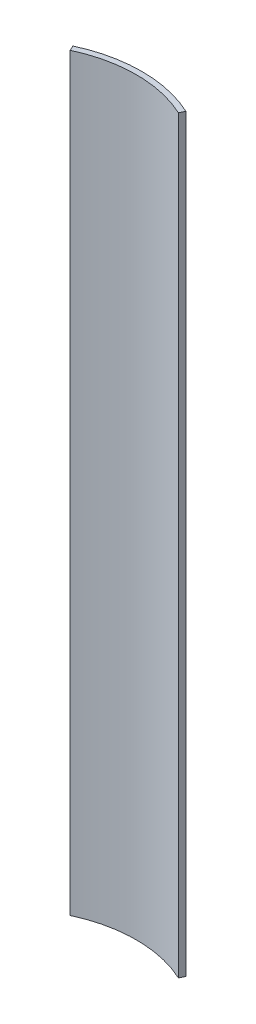
ISO-10303-21;
HEADER;
FILE_DESCRIPTION(('STEP AP214'),'2;1');
FILE_NAME('part.step','',(''),(''),'','','');
FILE_SCHEMA(('AUTOMOTIVE_DESIGN { 1 0 10303 214 1 1 1 1 }'));
ENDSEC;
DATA;
#1=APPLICATION_CONTEXT('core data for automotive mechanical design processes');
#2=APPLICATION_PROTOCOL_DEFINITION('international standard','automotive_design',2000,#1);
#3=PRODUCT_CONTEXT('',#1,'mechanical');
#4=PRODUCT('Part','Part','',(#3));
#5=PRODUCT_RELATED_PRODUCT_CATEGORY('part','',(#4));
#6=PRODUCT_DEFINITION_FORMATION('','',#4);
#7=PRODUCT_DEFINITION_CONTEXT('part definition',#1,'design');
#8=PRODUCT_DEFINITION('design','',#6,#7);
#9=PRODUCT_DEFINITION_SHAPE('','',#8);
#10=(LENGTH_UNIT() NAMED_UNIT(*) SI_UNIT(.MILLI.,.METRE.));
#11=(NAMED_UNIT(*) PLANE_ANGLE_UNIT() SI_UNIT($,.RADIAN.));
#12=(NAMED_UNIT(*) SI_UNIT($,.STERADIAN.) SOLID_ANGLE_UNIT());
#13=UNCERTAINTY_MEASURE_WITH_UNIT(LENGTH_MEASURE(1.E-05),#10,'distance_accuracy_value','');
#14=(GEOMETRIC_REPRESENTATION_CONTEXT(3) GLOBAL_UNCERTAINTY_ASSIGNED_CONTEXT((#13)) GLOBAL_UNIT_ASSIGNED_CONTEXT((#10,
#11,#12)) REPRESENTATION_CONTEXT('',''));
#15=CARTESIAN_POINT('',(0.,0.,0.));
#16=DIRECTION('',(0.,0.,1.));
#17=DIRECTION('',(1.,0.,0.));
#18=AXIS2_PLACEMENT_3D('',#15,#16,#17);
#19=CARTESIAN_POINT('',(0.,427.1518,0.));
#20=DIRECTION('',(0.,-1.,0.));
#21=DIRECTION('',(0.,0.,-1.));
#22=AXIS2_PLACEMENT_3D('',#19,#20,#21);
#23=CYLINDRICAL_SURFACE('',#22,76.2);
#24=CARTESIAN_POINT('',(0.,0.,0.));
#25=DIRECTION('',(0.,1.,0.));
#26=DIRECTION('',(0.,0.,1.));
#27=AXIS2_PLACEMENT_3D('',#24,#25,#26);
#28=CIRCLE('',#27,76.2);
#29=CARTESIAN_POINT('',(32.2035115446414,0.,-69.0606533721927));
#30=VERTEX_POINT('',#29);
#31=CARTESIAN_POINT('',(-32.2035115446414,0.,-69.0606533721927));
#32=VERTEX_POINT('',#31);
#33=EDGE_CURVE('E96',#30,#32,#28,.T.);
#34=ORIENTED_EDGE('',*,*,#33,.T.);
#35=DIRECTION('',(0.,-1.,0.));
#36=VECTOR('',#35,1.);
#37=CARTESIAN_POINT('',(-32.2035115446414,427.1518,-69.0606533721927));
#38=LINE('',#37,#36);
#39=CARTESIAN_POINT('',(-32.2035115446414,427.1518,-69.0606533721927));
#40=VERTEX_POINT('',#39);
#41=EDGE_CURVE('E11',#40,#32,#38,.T.);
#42=ORIENTED_EDGE('',*,*,#41,.F.);
#43=CARTESIAN_POINT('',(0.,427.1518,0.));
#44=DIRECTION('',(0.,1.,0.));
#45=DIRECTION('',(0.,0.,1.));
#46=AXIS2_PLACEMENT_3D('',#43,#44,#45);
#47=CIRCLE('',#46,76.2);
#48=CARTESIAN_POINT('',(32.2035115446414,427.1518,-69.0606533721927));
#49=VERTEX_POINT('',#48);
#50=EDGE_CURVE('E84',#49,#40,#47,.T.);
#51=ORIENTED_EDGE('',*,*,#50,.F.);
#52=DIRECTION('',(0.,-1.,0.));
#53=VECTOR('',#52,1.);
#54=CARTESIAN_POINT('',(32.2035115446414,427.1518,-69.0606533721927));
#55=LINE('',#54,#53);
#56=EDGE_CURVE('E92',#49,#30,#55,.T.);
#57=ORIENTED_EDGE('',*,*,#56,.T.);
#58=EDGE_LOOP('',(#34,#42,#51,#57));
#59=FACE_BOUND('',#58,.T.);
#60=ADVANCED_FACE('F33',(#59),#23,.T.);
#61=CARTESIAN_POINT('',(-30.8616985636147,427.1518,-66.1831261483513));
#62=DIRECTION('',(0.906307787036649,0.,-0.4226182617407));
#63=DIRECTION('',(-0.4226182617407,0.,-0.90630778703665));
#64=AXIS2_PLACEMENT_3D('',#61,#62,#63);
#65=PLANE('',#64);
#66=DIRECTION('',(0.4226182617407,0.,0.90630778703665));
#67=VECTOR('',#66,1.);
#68=CARTESIAN_POINT('',(-30.8616985636147,0.,-66.1831261483513));
#69=LINE('',#68,#67);
#70=CARTESIAN_POINT('',(-30.8616985636147,0.,-66.1831261483513));
#71=VERTEX_POINT('',#70);
#72=EDGE_CURVE('E88',#32,#71,#69,.T.);
#73=ORIENTED_EDGE('',*,*,#72,.T.);
#74=DIRECTION('',(0.,-1.,0.));
#75=VECTOR('',#74,1.);
#76=CARTESIAN_POINT('',(-30.8616985636147,427.1518,-66.1831261483513));
#77=LINE('',#76,#75);
#78=CARTESIAN_POINT('',(-30.8616985636147,427.1518,-66.1831261483513));
#79=VERTEX_POINT('',#78);
#80=EDGE_CURVE('E41',#79,#71,#77,.T.);
#81=ORIENTED_EDGE('',*,*,#80,.F.);
#82=DIRECTION('',(0.4226182617407,0.,0.90630778703665));
#83=VECTOR('',#82,1.);
#84=CARTESIAN_POINT('',(-30.8616985636147,427.1518,-66.1831261483513));
#85=LINE('',#84,#83);
#86=EDGE_CURVE('E79',#40,#79,#85,.T.);
#87=ORIENTED_EDGE('',*,*,#86,.F.);
#88=ORIENTED_EDGE('',*,*,#41,.T.);
#89=EDGE_LOOP('',(#73,#81,#87,#88));
#90=FACE_BOUND('',#89,.T.);
#91=ADVANCED_FACE('F87',(#90),#65,.F.);
#92=CARTESIAN_POINT('',(0.,427.1518,0.));
#93=DIRECTION('',(0.,-1.,0.));
#94=DIRECTION('',(0.,0.,-1.));
#95=AXIS2_PLACEMENT_3D('',#92,#93,#94);
#96=CYLINDRICAL_SURFACE('',#95,73.025);
#97=CARTESIAN_POINT('',(0.,0.,0.));
#98=DIRECTION('',(0.,-1.,0.));
#99=DIRECTION('',(0.,0.,1.));
#100=AXIS2_PLACEMENT_3D('',#97,#98,#99);
#101=CIRCLE('',#100,73.025);
#102=CARTESIAN_POINT('',(30.8616985636146,0.,-66.1831261483513));
#103=VERTEX_POINT('',#102);
#104=EDGE_CURVE('E66',#71,#103,#101,.T.);
#105=ORIENTED_EDGE('',*,*,#104,.T.);
#106=DIRECTION('',(0.,-1.,0.));
#107=VECTOR('',#106,1.);
#108=CARTESIAN_POINT('',(30.8616985636146,427.1518,-66.1831261483513));
#109=LINE('',#108,#107);
#110=CARTESIAN_POINT('',(30.8616985636146,427.1518,-66.1831261483513));
#111=VERTEX_POINT('',#110);
#112=EDGE_CURVE('E89',#111,#103,#109,.T.);
#113=ORIENTED_EDGE('',*,*,#112,.F.);
#114=CARTESIAN_POINT('',(0.,427.1518,0.));
#115=DIRECTION('',(0.,-1.,0.));
#116=DIRECTION('',(0.,0.,1.));
#117=AXIS2_PLACEMENT_3D('',#114,#115,#116);
#118=CIRCLE('',#117,73.025);
#119=EDGE_CURVE('E82',#79,#111,#118,.T.);
#120=ORIENTED_EDGE('',*,*,#119,.F.);
#121=ORIENTED_EDGE('',*,*,#80,.T.);
#122=EDGE_LOOP('',(#105,#113,#120,#121));
#123=FACE_BOUND('',#122,.T.);
#124=ADVANCED_FACE('F90',(#123),#96,.F.);
#125=CARTESIAN_POINT('',(30.8616985636146,427.1518,-66.1831261483513));
#126=DIRECTION('',(-0.90630778703665,0.,-0.4226182617407));
#127=DIRECTION('',(-0.4226182617407,0.,0.90630778703665));
#128=AXIS2_PLACEMENT_3D('',#125,#126,#127);
#129=PLANE('',#128);
#130=DIRECTION('',(0.4226182617407,0.,-0.90630778703665));
#131=VECTOR('',#130,1.);
#132=CARTESIAN_POINT('',(30.8616985636146,0.,-66.1831261483513));
#133=LINE('',#132,#131);
#134=EDGE_CURVE('E72',#103,#30,#133,.T.);
#135=ORIENTED_EDGE('',*,*,#134,.T.);
#136=ORIENTED_EDGE('',*,*,#56,.F.);
#137=DIRECTION('',(0.4226182617407,0.,-0.90630778703665));
#138=VECTOR('',#137,1.);
#139=CARTESIAN_POINT('',(30.8616985636146,427.1518,-66.1831261483513));
#140=LINE('',#139,#138);
#141=EDGE_CURVE('E49',#111,#49,#140,.T.);
#142=ORIENTED_EDGE('',*,*,#141,.F.);
#143=ORIENTED_EDGE('',*,*,#112,.T.);
#144=EDGE_LOOP('',(#135,#136,#142,#143));
#145=FACE_BOUND('',#144,.T.);
#146=ADVANCED_FACE('F103',(#145),#129,.F.);
#147=CARTESIAN_POINT('',(0.,427.1518,0.));
#148=DIRECTION('',(0.,1.,0.));
#149=DIRECTION('',(0.,0.,1.));
#150=AXIS2_PLACEMENT_3D('',#147,#148,#149);
#151=PLANE('',#150);
#152=ORIENTED_EDGE('',*,*,#50,.T.);
#153=ORIENTED_EDGE('',*,*,#86,.T.);
#154=ORIENTED_EDGE('',*,*,#119,.T.);
#155=ORIENTED_EDGE('',*,*,#141,.T.);
#156=EDGE_LOOP('',(#152,#153,#154,#155));
#157=FACE_BOUND('',#156,.T.);
#158=ADVANCED_FACE('F80',(#157),#151,.T.);
#159=CARTESIAN_POINT('',(0.,0.,0.));
#160=DIRECTION('',(0.,1.,0.));
#161=DIRECTION('',(0.,0.,1.));
#162=AXIS2_PLACEMENT_3D('',#159,#160,#161);
#163=PLANE('',#162);
#164=ORIENTED_EDGE('',*,*,#33,.F.);
#165=ORIENTED_EDGE('',*,*,#134,.F.);
#166=ORIENTED_EDGE('',*,*,#104,.F.);
#167=ORIENTED_EDGE('',*,*,#72,.F.);
#168=EDGE_LOOP('',(#164,#165,#166,#167));
#169=FACE_BOUND('',#168,.T.);
#170=ADVANCED_FACE('F106',(#169),#163,.F.);
#171=CLOSED_SHELL('',(#60,#91,#124,#146,#158,#170));
#172=MANIFOLD_SOLID_BREP('B2',#171);
#173=ADVANCED_BREP_SHAPE_REPRESENTATION('',(#18,#172),#14);
#174=SHAPE_DEFINITION_REPRESENTATION(#9,#173);
ENDSEC;
END-ISO-10303-21;
